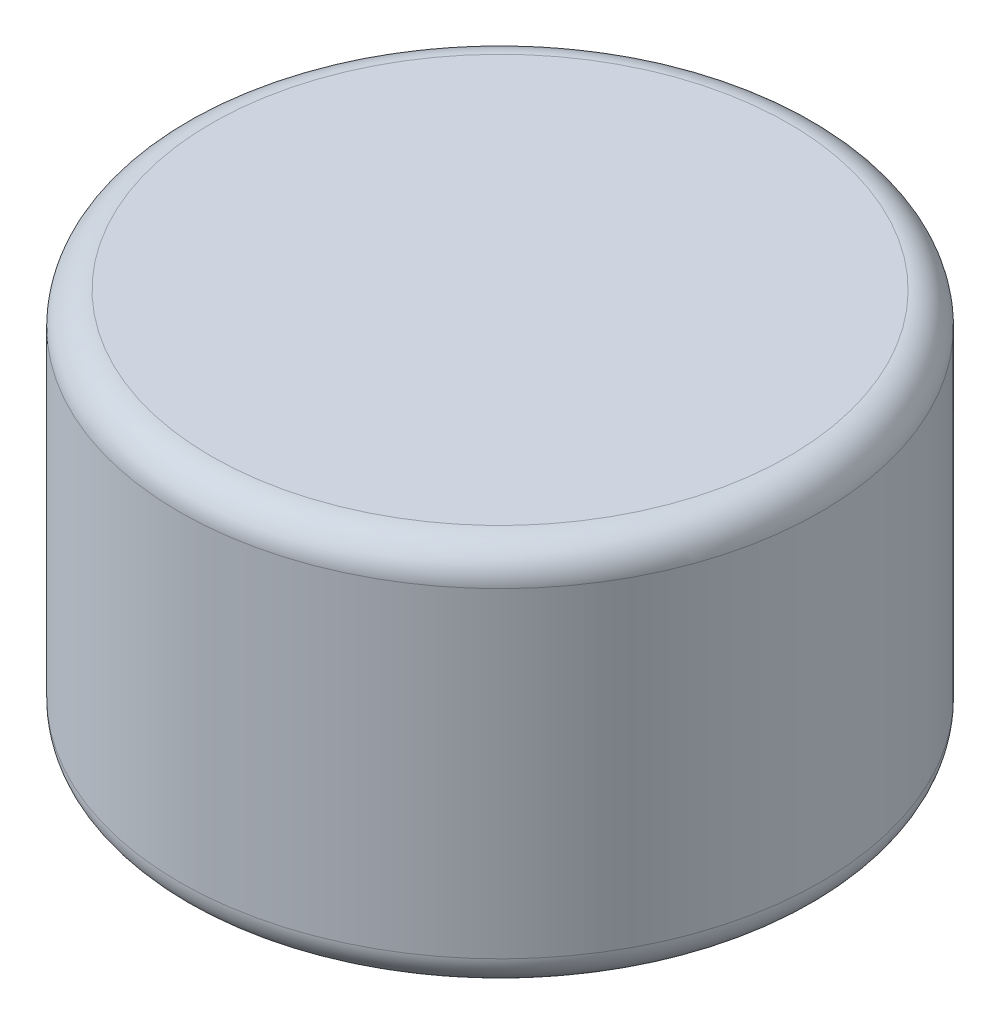
ISO-10303-21;
HEADER;
FILE_DESCRIPTION(('STEP AP214'),'2;1');
FILE_NAME('part.step','',(''),(''),'','','');
FILE_SCHEMA(('AUTOMOTIVE_DESIGN { 1 0 10303 214 1 1 1 1 }'));
ENDSEC;
DATA;
#1=APPLICATION_CONTEXT('core data for automotive mechanical design processes');
#2=APPLICATION_PROTOCOL_DEFINITION('international standard','automotive_design',2000,#1);
#3=PRODUCT_CONTEXT('',#1,'mechanical');
#4=PRODUCT('Part','Part','',(#3));
#5=PRODUCT_RELATED_PRODUCT_CATEGORY('part','',(#4));
#6=PRODUCT_DEFINITION_FORMATION('','',#4);
#7=PRODUCT_DEFINITION_CONTEXT('part definition',#1,'design');
#8=PRODUCT_DEFINITION('design','',#6,#7);
#9=PRODUCT_DEFINITION_SHAPE('','',#8);
#10=(LENGTH_UNIT() NAMED_UNIT(*) SI_UNIT(.MILLI.,.METRE.));
#11=(NAMED_UNIT(*) PLANE_ANGLE_UNIT() SI_UNIT($,.RADIAN.));
#12=(NAMED_UNIT(*) SI_UNIT($,.STERADIAN.) SOLID_ANGLE_UNIT());
#13=UNCERTAINTY_MEASURE_WITH_UNIT(LENGTH_MEASURE(1.E-05),#10,'distance_accuracy_value','');
#14=(GEOMETRIC_REPRESENTATION_CONTEXT(3) GLOBAL_UNCERTAINTY_ASSIGNED_CONTEXT((#13)) GLOBAL_UNIT_ASSIGNED_CONTEXT((#10,
#11,#12)) REPRESENTATION_CONTEXT('',''));
#15=CARTESIAN_POINT('',(0.,0.,0.));
#16=DIRECTION('',(0.,0.,1.));
#17=DIRECTION('',(1.,0.,0.));
#18=AXIS2_PLACEMENT_3D('',#15,#16,#17);
#19=CARTESIAN_POINT('',(0.,3.,0.));
#20=DIRECTION('',(0.,-1.,0.));
#21=DIRECTION('',(0.,0.,-1.));
#22=AXIS2_PLACEMENT_3D('',#19,#20,#21);
#23=CYLINDRICAL_SURFACE('',#22,2.5);
#24=CARTESIAN_POINT('',(0.,0.25,0.));
#25=DIRECTION('',(0.,1.,0.));
#26=DIRECTION('',(0.,0.,1.));
#27=AXIS2_PLACEMENT_3D('',#24,#25,#26);
#28=CIRCLE('',#27,2.5);
#29=CARTESIAN_POINT('',(0.,0.25,2.5));
#30=VERTEX_POINT('',#29);
#31=EDGE_CURVE('E53',#30,#30,#28,.T.);
#32=ORIENTED_EDGE('',*,*,#31,.T.);
#33=EDGE_LOOP('',(#32));
#34=FACE_BOUND('',#33,.T.);
#35=CARTESIAN_POINT('',(0.,2.75,0.));
#36=DIRECTION('',(0.,1.,0.));
#37=DIRECTION('',(0.,0.,1.));
#38=AXIS2_PLACEMENT_3D('',#35,#36,#37);
#39=CIRCLE('',#38,2.5);
#40=CARTESIAN_POINT('',(0.,2.75,2.5));
#41=VERTEX_POINT('',#40);
#42=EDGE_CURVE('E59',#41,#41,#39,.F.);
#43=ORIENTED_EDGE('',*,*,#42,.T.);
#44=EDGE_LOOP('',(#43));
#45=FACE_BOUND('',#44,.T.);
#46=ADVANCED_FACE('F39',(#34,#45),#23,.T.);
#47=CARTESIAN_POINT('',(0.,3.,0.));
#48=DIRECTION('',(0.,1.,0.));
#49=DIRECTION('',(0.,0.,1.));
#50=AXIS2_PLACEMENT_3D('',#47,#48,#49);
#51=PLANE('',#50);
#52=CARTESIAN_POINT('',(0.,3.,0.));
#53=DIRECTION('',(0.,1.,0.));
#54=DIRECTION('',(0.,0.,1.));
#55=AXIS2_PLACEMENT_3D('',#52,#53,#54);
#56=CIRCLE('',#55,2.25);
#57=CARTESIAN_POINT('',(0.,3.,2.25));
#58=VERTEX_POINT('',#57);
#59=EDGE_CURVE('E10',#58,#58,#56,.T.);
#60=ORIENTED_EDGE('',*,*,#59,.T.);
#61=EDGE_LOOP('',(#60));
#62=FACE_BOUND('',#61,.T.);
#63=ADVANCED_FACE('F77',(#62),#51,.T.);
#64=CARTESIAN_POINT('',(0.,0.,0.));
#65=DIRECTION('',(0.,1.,0.));
#66=DIRECTION('',(0.,0.,1.));
#67=AXIS2_PLACEMENT_3D('',#64,#65,#66);
#68=PLANE('',#67);
#69=CARTESIAN_POINT('',(0.,0.,0.));
#70=DIRECTION('',(0.,1.,0.));
#71=DIRECTION('',(0.,0.,1.));
#72=AXIS2_PLACEMENT_3D('',#69,#70,#71);
#73=CIRCLE('',#72,2.25);
#74=CARTESIAN_POINT('',(0.,0.,2.25));
#75=VERTEX_POINT('',#74);
#76=EDGE_CURVE('E47',#75,#75,#73,.F.);
#77=ORIENTED_EDGE('',*,*,#76,.T.);
#78=EDGE_LOOP('',(#77));
#79=FACE_BOUND('',#78,.T.);
#80=ADVANCED_FACE('F74',(#79),#68,.F.);
#81=CARTESIAN_POINT('',(0.,0.25,0.));
#82=DIRECTION('',(0.,1.,0.));
#83=DIRECTION('',(0.,0.,1.));
#84=AXIS2_PLACEMENT_3D('',#81,#82,#83);
#85=TOROIDAL_SURFACE('',#84,2.25,0.25);
#86=ORIENTED_EDGE('',*,*,#76,.F.);
#87=EDGE_LOOP('',(#86));
#88=FACE_BOUND('',#87,.T.);
#89=ORIENTED_EDGE('',*,*,#31,.F.);
#90=EDGE_LOOP('',(#89));
#91=FACE_BOUND('',#90,.T.);
#92=ADVANCED_FACE('F70',(#88,#91),#85,.T.);
#93=CARTESIAN_POINT('',(0.,2.75,0.));
#94=DIRECTION('',(0.,1.,0.));
#95=DIRECTION('',(0.,0.,1.));
#96=AXIS2_PLACEMENT_3D('',#93,#94,#95);
#97=TOROIDAL_SURFACE('',#96,2.25,0.25);
#98=ORIENTED_EDGE('',*,*,#42,.F.);
#99=EDGE_LOOP('',(#98));
#100=FACE_BOUND('',#99,.T.);
#101=ORIENTED_EDGE('',*,*,#59,.F.);
#102=EDGE_LOOP('',(#101));
#103=FACE_BOUND('',#102,.T.);
#104=ADVANCED_FACE('F41',(#100,#103),#97,.T.);
#105=CLOSED_SHELL('',(#46,#63,#80,#92,#104));
#106=MANIFOLD_SOLID_BREP('B2',#105);
#107=ADVANCED_BREP_SHAPE_REPRESENTATION('',(#18,#106),#14);
#108=SHAPE_DEFINITION_REPRESENTATION(#9,#107);
ENDSEC;
END-ISO-10303-21;
